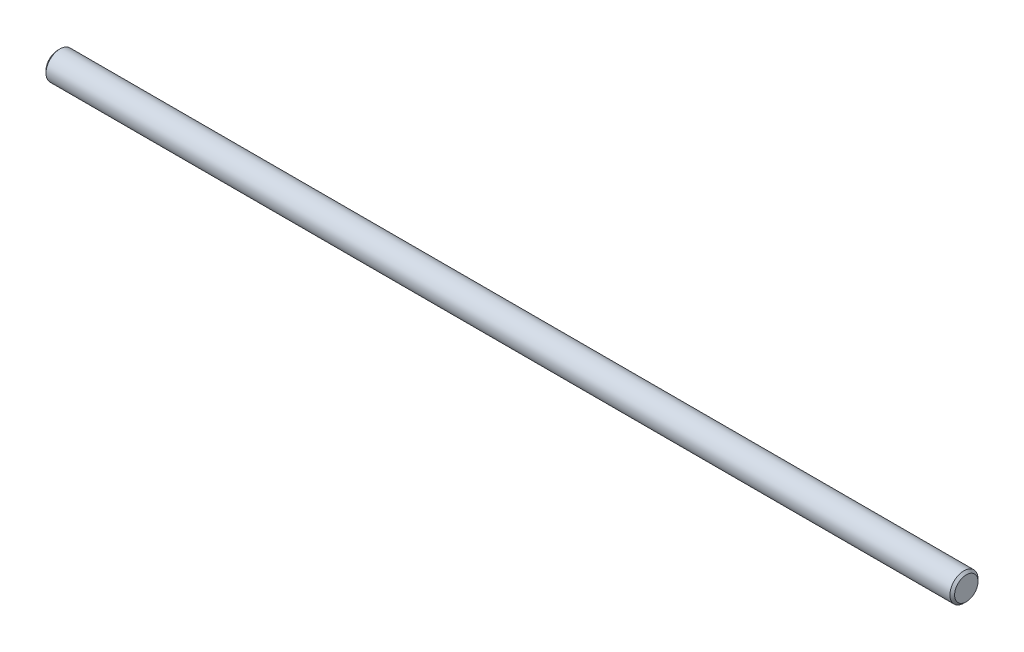
ISO-10303-21;
HEADER;
FILE_DESCRIPTION(('STEP AP214'),'2;1');
FILE_NAME('part.step','',(''),(''),'','','');
FILE_SCHEMA(('AUTOMOTIVE_DESIGN { 1 0 10303 214 1 1 1 1 }'));
ENDSEC;
DATA;
#1=APPLICATION_CONTEXT('core data for automotive mechanical design processes');
#2=APPLICATION_PROTOCOL_DEFINITION('international standard','automotive_design',2000,#1);
#3=PRODUCT_CONTEXT('',#1,'mechanical');
#4=PRODUCT('Part','Part','',(#3));
#5=PRODUCT_RELATED_PRODUCT_CATEGORY('part','',(#4));
#6=PRODUCT_DEFINITION_FORMATION('','',#4);
#7=PRODUCT_DEFINITION_CONTEXT('part definition',#1,'design');
#8=PRODUCT_DEFINITION('design','',#6,#7);
#9=PRODUCT_DEFINITION_SHAPE('','',#8);
#10=(LENGTH_UNIT() NAMED_UNIT(*) SI_UNIT(.MILLI.,.METRE.));
#11=(NAMED_UNIT(*) PLANE_ANGLE_UNIT() SI_UNIT($,.RADIAN.));
#12=(NAMED_UNIT(*) SI_UNIT($,.STERADIAN.) SOLID_ANGLE_UNIT());
#13=UNCERTAINTY_MEASURE_WITH_UNIT(LENGTH_MEASURE(1.E-05),#10,'distance_accuracy_value','');
#14=(GEOMETRIC_REPRESENTATION_CONTEXT(3) GLOBAL_UNCERTAINTY_ASSIGNED_CONTEXT((#13)) GLOBAL_UNIT_ASSIGNED_CONTEXT((#10,
#11,#12)) REPRESENTATION_CONTEXT('',''));
#15=CARTESIAN_POINT('',(0.,0.,0.));
#16=DIRECTION('',(0.,0.,1.));
#17=DIRECTION('',(1.,0.,0.));
#18=AXIS2_PLACEMENT_3D('',#15,#16,#17);
#19=CARTESIAN_POINT('',(388.,0.,0.));
#20=DIRECTION('',(-1.,0.,0.));
#21=DIRECTION('',(0.,0.,1.));
#22=AXIS2_PLACEMENT_3D('',#19,#20,#21);
#23=CYLINDRICAL_SURFACE('',#22,6.);
#24=CARTESIAN_POINT('',(387.,0.,0.));
#25=DIRECTION('',(1.,0.,0.));
#26=DIRECTION('',(0.,0.,-1.));
#27=AXIS2_PLACEMENT_3D('',#24,#25,#26);
#28=CIRCLE('',#27,6.);
#29=CARTESIAN_POINT('',(387.,0.,6.));
#30=VERTEX_POINT('',#29);
#31=EDGE_CURVE('E38',#30,#30,#28,.F.);
#32=CARTESIAN_POINT('',(1.00000000000011,0.,0.));
#33=DIRECTION('',(1.,0.,0.));
#34=DIRECTION('',(0.,0.,-1.));
#35=AXIS2_PLACEMENT_3D('',#32,#33,#34);
#36=CIRCLE('',#35,6.);
#37=CARTESIAN_POINT('',(1.00000000000006,0.,6.));
#38=VERTEX_POINT('',#37);
#39=EDGE_CURVE('E42',#38,#38,#36,.T.);
#40=CARTESIAN_POINT('',(387.,0.,6.));
#41=CARTESIAN_POINT('',(382.979166666667,0.,6.));
#42=CARTESIAN_POINT('',(378.958333333333,0.,6.));
#43=CARTESIAN_POINT('',(370.916666666667,0.,6.));
#44=CARTESIAN_POINT('',(366.895833333333,0.,6.));
#45=CARTESIAN_POINT('',(358.854166666667,0.,6.));
#46=CARTESIAN_POINT('',(354.833333333333,0.,6.));
#47=CARTESIAN_POINT('',(346.791666666667,0.,6.));
#48=CARTESIAN_POINT('',(342.770833333333,0.,6.));
#49=CARTESIAN_POINT('',(334.729166666667,0.,6.));
#50=CARTESIAN_POINT('',(330.708333333333,0.,6.));
#51=CARTESIAN_POINT('',(322.666666666667,0.,6.));
#52=CARTESIAN_POINT('',(318.645833333333,0.,6.));
#53=CARTESIAN_POINT('',(310.604166666667,0.,6.));
#54=CARTESIAN_POINT('',(306.583333333333,0.,6.));
#55=CARTESIAN_POINT('',(298.541666666667,0.,6.));
#56=CARTESIAN_POINT('',(294.520833333333,0.,6.));
#57=CARTESIAN_POINT('',(286.479166666667,0.,6.));
#58=CARTESIAN_POINT('',(282.458333333333,0.,6.));
#59=CARTESIAN_POINT('',(274.416666666667,0.,6.));
#60=CARTESIAN_POINT('',(270.395833333333,0.,6.));
#61=CARTESIAN_POINT('',(262.354166666667,0.,6.));
#62=CARTESIAN_POINT('',(258.333333333333,0.,6.));
#63=CARTESIAN_POINT('',(250.291666666667,0.,6.));
#64=CARTESIAN_POINT('',(246.270833333333,0.,6.));
#65=CARTESIAN_POINT('',(238.229166666667,0.,6.));
#66=CARTESIAN_POINT('',(234.208333333333,0.,6.));
#67=CARTESIAN_POINT('',(226.166666666667,0.,6.));
#68=CARTESIAN_POINT('',(222.145833333333,0.,6.));
#69=CARTESIAN_POINT('',(214.104166666667,0.,6.));
#70=CARTESIAN_POINT('',(210.083333333333,0.,6.));
#71=CARTESIAN_POINT('',(202.041666666667,0.,6.));
#72=CARTESIAN_POINT('',(198.020833333333,0.,6.));
#73=CARTESIAN_POINT('',(189.979166666667,0.,6.));
#74=CARTESIAN_POINT('',(185.958333333333,0.,6.));
#75=CARTESIAN_POINT('',(177.916666666667,0.,6.));
#76=CARTESIAN_POINT('',(173.895833333333,0.,6.));
#77=CARTESIAN_POINT('',(165.854166666667,0.,6.));
#78=CARTESIAN_POINT('',(161.833333333333,0.,6.));
#79=CARTESIAN_POINT('',(153.791666666667,0.,6.));
#80=CARTESIAN_POINT('',(149.770833333333,0.,6.));
#81=CARTESIAN_POINT('',(141.729166666667,0.,6.));
#82=CARTESIAN_POINT('',(137.708333333333,0.,6.));
#83=CARTESIAN_POINT('',(129.666666666667,0.,6.));
#84=CARTESIAN_POINT('',(125.645833333333,0.,6.));
#85=CARTESIAN_POINT('',(117.604166666667,0.,6.));
#86=CARTESIAN_POINT('',(113.583333333333,0.,6.));
#87=CARTESIAN_POINT('',(105.541666666667,0.,6.));
#88=CARTESIAN_POINT('',(101.520833333333,0.,6.));
#89=CARTESIAN_POINT('',(93.4791666666668,0.,6.));
#90=CARTESIAN_POINT('',(89.4583333333334,0.,6.));
#91=CARTESIAN_POINT('',(81.4166666666668,0.,6.));
#92=CARTESIAN_POINT('',(77.3958333333335,0.,6.));
#93=CARTESIAN_POINT('',(69.3541666666668,0.,6.));
#94=CARTESIAN_POINT('',(65.3333333333334,0.,6.));
#95=CARTESIAN_POINT('',(57.2916666666667,0.,6.));
#96=CARTESIAN_POINT('',(53.2708333333334,0.,6.));
#97=CARTESIAN_POINT('',(45.2291666666667,0.,6.));
#98=CARTESIAN_POINT('',(41.2083333333334,0.,6.));
#99=CARTESIAN_POINT('',(33.1666666666668,0.,6.));
#100=CARTESIAN_POINT('',(29.1458333333334,0.,6.));
#101=CARTESIAN_POINT('',(21.1041666666668,0.,6.));
#102=CARTESIAN_POINT('',(17.0833333333334,0.,6.));
#103=CARTESIAN_POINT('',(9.04166666666671,0.,6.));
#104=CARTESIAN_POINT('',(5.02083333333338,0.,6.));
#105=CARTESIAN_POINT('',(1.00000000000006,0.,6.));
#106=B_SPLINE_CURVE_WITH_KNOTS('',3,(#40,#41,#42,#43,#44,#45,#46,#47,#48,#49,#50,#51,#52,#53,
#54,#55,#56,#57,#58,#59,#60,#61,#62,#63,#64,#65,#66,#67,#68,#69,#70,#71,#72,#73,#74,#75,#76,#77,
#78,#79,#80,#81,#82,#83,#84,#85,#86,#87,#88,#89,#90,#91,#92,#93,#94,#95,#96,#97,#98,#99,#100,
#101,#102,#103,#104,#105),.UNSPECIFIED.,.F.,.F.,(4,2,2,2,2,2,2,2,2,2,2,2,2,2,2,2,2,2,2,2,2,2,2,
2,2,2,2,2,2,2,2,2,4),(0.,12.0625,24.125,36.1875,48.25,60.3125,72.375,84.4375000000001,96.5,
108.5625,120.625,132.6875,144.75,156.8125,168.875,180.9375,193.,205.0625,217.125,229.1875,
241.25,253.3125,265.375,277.4375,289.5,301.5625,313.625,325.6875,337.75,349.8125,361.875,
373.9375,386.),.UNSPECIFIED.);
#107=EDGE_CURVE('BSEAM31',#30,#38,#106,.T.);
#108=ORIENTED_EDGE('',*,*,#31,.T.);
#109=ORIENTED_EDGE('',*,*,#39,.T.);
#110=ORIENTED_EDGE('',*,*,#107,.T.);
#111=ORIENTED_EDGE('',*,*,#107,.F.);
#112=EDGE_LOOP('',(#108,#110,#109,#111));
#113=FACE_BOUND('',#112,.T.);
#114=ADVANCED_FACE('F31',(#113),#23,.T.);
#115=CARTESIAN_POINT('',(388.,0.,0.));
#116=DIRECTION('',(1.,0.,0.));
#117=DIRECTION('',(0.,0.,-1.));
#118=AXIS2_PLACEMENT_3D('',#115,#116,#117);
#119=PLANE('',#118);
#120=CARTESIAN_POINT('',(388.,0.,0.));
#121=DIRECTION('',(1.,0.,0.));
#122=DIRECTION('',(0.,0.,-1.));
#123=AXIS2_PLACEMENT_3D('',#120,#121,#122);
#124=CIRCLE('',#123,5.00000000000011);
#125=CARTESIAN_POINT('',(388.,0.,-5.00000000000011));
#126=VERTEX_POINT('',#125);
#127=EDGE_CURVE('E46',#126,#126,#124,.T.);
#128=ORIENTED_EDGE('',*,*,#127,.T.);
#129=EDGE_LOOP('',(#128));
#130=FACE_BOUND('',#129,.T.);
#131=ADVANCED_FACE('F52',(#130),#119,.T.);
#132=CARTESIAN_POINT('',(0.,0.,0.));
#133=DIRECTION('',(1.,0.,0.));
#134=DIRECTION('',(0.,0.,-1.));
#135=AXIS2_PLACEMENT_3D('',#132,#133,#134);
#136=PLANE('',#135);
#137=CARTESIAN_POINT('',(0.,0.,0.));
#138=DIRECTION('',(1.,0.,0.));
#139=DIRECTION('',(0.,0.,-1.));
#140=AXIS2_PLACEMENT_3D('',#137,#138,#139);
#141=CIRCLE('',#140,4.99999999999989);
#142=CARTESIAN_POINT('',(0.,0.,-4.99999999999989));
#143=VERTEX_POINT('',#142);
#144=EDGE_CURVE('E10',#143,#143,#141,.F.);
#145=ORIENTED_EDGE('',*,*,#144,.T.);
#146=EDGE_LOOP('',(#145));
#147=FACE_BOUND('',#146,.T.);
#148=ADVANCED_FACE('F56',(#147),#136,.F.);
#149=CARTESIAN_POINT('',(388.,0.,0.));
#150=DIRECTION('',(-1.,0.,0.));
#151=DIRECTION('',(0.,0.,1.));
#152=AXIS2_PLACEMENT_3D('',#149,#150,#151);
#153=CONICAL_SURFACE('',#152,5.00000000000011,0.785398163397474);
#154=ORIENTED_EDGE('',*,*,#31,.F.);
#155=EDGE_LOOP('',(#154));
#156=FACE_BOUND('',#155,.T.);
#157=ORIENTED_EDGE('',*,*,#127,.F.);
#158=EDGE_LOOP('',(#157));
#159=FACE_BOUND('',#158,.T.);
#160=ADVANCED_FACE('F54',(#156,#159),#153,.T.);
#161=CARTESIAN_POINT('',(1.00000000000011,0.,0.));
#162=DIRECTION('',(1.,0.,0.));
#163=DIRECTION('',(0.,0.,-1.));
#164=AXIS2_PLACEMENT_3D('',#161,#162,#163);
#165=CONICAL_SURFACE('',#164,6.,0.785398163397447);
#166=ORIENTED_EDGE('',*,*,#144,.F.);
#167=EDGE_LOOP('',(#166));
#168=FACE_BOUND('',#167,.T.);
#169=ORIENTED_EDGE('',*,*,#39,.F.);
#170=EDGE_LOOP('',(#169));
#171=FACE_BOUND('',#170,.T.);
#172=ADVANCED_FACE('F33',(#168,#171),#165,.T.);
#173=CLOSED_SHELL('',(#114,#131,#148,#160,#172));
#174=MANIFOLD_SOLID_BREP('B2',#173);
#175=ADVANCED_BREP_SHAPE_REPRESENTATION('',(#18,#174),#14);
#176=SHAPE_DEFINITION_REPRESENTATION(#9,#175);
ENDSEC;
END-ISO-10303-21;
